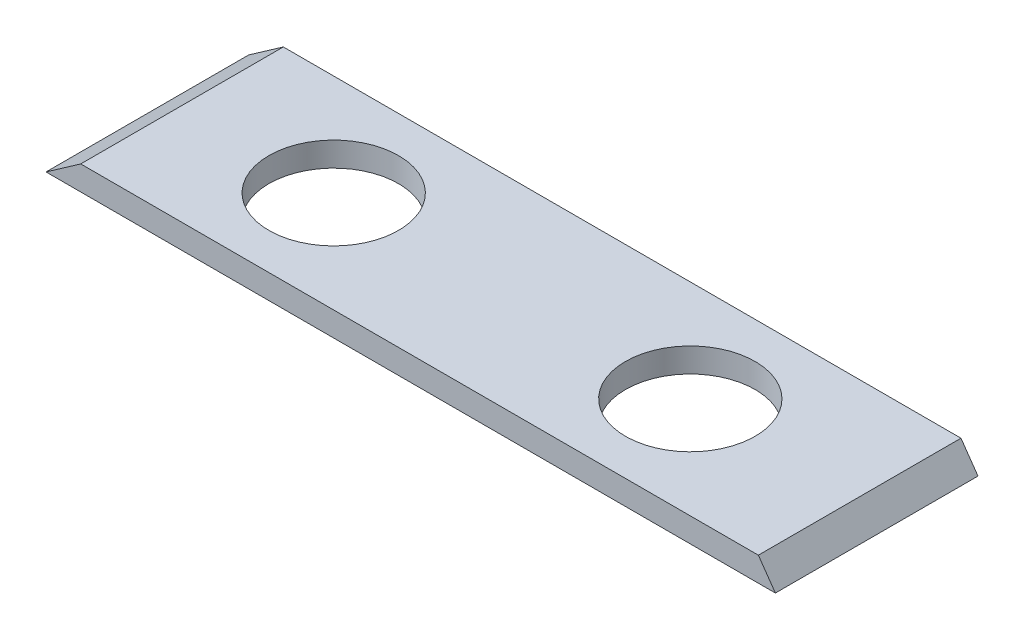
ISO-10303-21;
HEADER;
FILE_DESCRIPTION(('STEP AP214'),'2;1');
FILE_NAME('part.step','',(''),(''),'','','');
FILE_SCHEMA(('AUTOMOTIVE_DESIGN { 1 0 10303 214 1 1 1 1 }'));
ENDSEC;
DATA;
#1=APPLICATION_CONTEXT('core data for automotive mechanical design processes');
#2=APPLICATION_PROTOCOL_DEFINITION('international standard','automotive_design',2000,#1);
#3=PRODUCT_CONTEXT('',#1,'mechanical');
#4=PRODUCT('Part','Part','',(#3));
#5=PRODUCT_RELATED_PRODUCT_CATEGORY('part','',(#4));
#6=PRODUCT_DEFINITION_FORMATION('','',#4);
#7=PRODUCT_DEFINITION_CONTEXT('part definition',#1,'design');
#8=PRODUCT_DEFINITION('design','',#6,#7);
#9=PRODUCT_DEFINITION_SHAPE('','',#8);
#10=(LENGTH_UNIT() NAMED_UNIT(*) SI_UNIT(.MILLI.,.METRE.));
#11=(NAMED_UNIT(*) PLANE_ANGLE_UNIT() SI_UNIT($,.RADIAN.));
#12=(NAMED_UNIT(*) SI_UNIT($,.STERADIAN.) SOLID_ANGLE_UNIT());
#13=UNCERTAINTY_MEASURE_WITH_UNIT(LENGTH_MEASURE(1.E-05),#10,'distance_accuracy_value','');
#14=(GEOMETRIC_REPRESENTATION_CONTEXT(3) GLOBAL_UNCERTAINTY_ASSIGNED_CONTEXT((#13)) GLOBAL_UNIT_ASSIGNED_CONTEXT((#10,
#11,#12)) REPRESENTATION_CONTEXT('',''));
#15=CARTESIAN_POINT('',(0.,0.,0.));
#16=DIRECTION('',(0.,0.,1.));
#17=DIRECTION('',(1.,0.,0.));
#18=AXIS2_PLACEMENT_3D('',#15,#16,#17);
#19=CARTESIAN_POINT('',(-40.7155559797737,2.99999999999999,25.));
#20=DIRECTION('',(0.57357643635105,-0.819152044288989,0.));
#21=DIRECTION('',(0.819152044288989,0.57357643635105,0.));
#22=AXIS2_PLACEMENT_3D('',#19,#20,#21);
#23=PLANE('',#22);
#24=DIRECTION('',(-0.819152044288989,-0.57357643635105,0.));
#25=VECTOR('',#24,1.);
#26=CARTESIAN_POINT('',(-40.7155559797737,2.99999999999999,0.));
#27=LINE('',#26,#25);
#28=CARTESIAN_POINT('',(-40.7155559797737,2.99999999999999,0.));
#29=VERTEX_POINT('',#28);
#30=CARTESIAN_POINT('',(-45.,0.,0.));
#31=VERTEX_POINT('',#30);
#32=EDGE_CURVE('E100',#29,#31,#27,.T.);
#33=ORIENTED_EDGE('',*,*,#32,.T.);
#34=DIRECTION('',(0.,0.,-1.));
#35=VECTOR('',#34,1.);
#36=CARTESIAN_POINT('',(-45.,0.,25.));
#37=LINE('',#36,#35);
#38=CARTESIAN_POINT('',(-45.,0.,25.));
#39=VERTEX_POINT('',#38);
#40=EDGE_CURVE('E11',#39,#31,#37,.T.);
#41=ORIENTED_EDGE('',*,*,#40,.F.);
#42=DIRECTION('',(-0.819152044288989,-0.57357643635105,0.));
#43=VECTOR('',#42,1.);
#44=CARTESIAN_POINT('',(-40.7155559797737,2.99999999999999,25.));
#45=LINE('',#44,#43);
#46=CARTESIAN_POINT('',(-40.7155559797737,2.99999999999999,25.));
#47=VERTEX_POINT('',#46);
#48=EDGE_CURVE('E88',#47,#39,#45,.T.);
#49=ORIENTED_EDGE('',*,*,#48,.F.);
#50=DIRECTION('',(0.,0.,-1.));
#51=VECTOR('',#50,1.);
#52=CARTESIAN_POINT('',(-40.7155559797737,2.99999999999999,25.));
#53=LINE('',#52,#51);
#54=EDGE_CURVE('E96',#47,#29,#53,.T.);
#55=ORIENTED_EDGE('',*,*,#54,.T.);
#56=EDGE_LOOP('',(#33,#41,#49,#55));
#57=FACE_BOUND('',#56,.T.);
#58=ADVANCED_FACE('F37',(#57),#23,.F.);
#59=CARTESIAN_POINT('',(-45.,0.,25.));
#60=DIRECTION('',(0.,1.,0.));
#61=DIRECTION('',(0.,0.,1.));
#62=AXIS2_PLACEMENT_3D('',#59,#60,#61);
#63=PLANE('',#62);
#64=CARTESIAN_POINT('',(-22.,0.,12.5));
#65=DIRECTION('',(0.,1.,0.));
#66=DIRECTION('',(-1.,0.,0.));
#67=AXIS2_PLACEMENT_3D('',#64,#65,#66);
#68=CIRCLE('',#67,8.);
#69=CARTESIAN_POINT('',(-30.,0.,12.5));
#70=VERTEX_POINT('',#69);
#71=EDGE_CURVE('E120',#70,#70,#68,.T.);
#72=ORIENTED_EDGE('',*,*,#71,.T.);
#73=EDGE_LOOP('',(#72));
#74=FACE_BOUND('',#73,.T.);
#75=CARTESIAN_POINT('',(22.,0.,12.5));
#76=DIRECTION('',(0.,1.,0.));
#77=DIRECTION('',(-1.,0.,0.));
#78=AXIS2_PLACEMENT_3D('',#75,#76,#77);
#79=CIRCLE('',#78,8.);
#80=CARTESIAN_POINT('',(14.,0.,12.5));
#81=VERTEX_POINT('',#80);
#82=EDGE_CURVE('E103',#81,#81,#79,.T.);
#83=ORIENTED_EDGE('',*,*,#82,.T.);
#84=EDGE_LOOP('',(#83));
#85=FACE_BOUND('',#84,.T.);
#86=DIRECTION('',(1.,0.,0.));
#87=VECTOR('',#86,1.);
#88=CARTESIAN_POINT('',(-45.,0.,0.));
#89=LINE('',#88,#87);
#90=CARTESIAN_POINT('',(45.,0.,0.));
#91=VERTEX_POINT('',#90);
#92=EDGE_CURVE('E92',#31,#91,#89,.T.);
#93=ORIENTED_EDGE('',*,*,#92,.T.);
#94=DIRECTION('',(0.,0.,-1.));
#95=VECTOR('',#94,1.);
#96=CARTESIAN_POINT('',(45.,0.,25.));
#97=LINE('',#96,#95);
#98=CARTESIAN_POINT('',(45.,0.,25.));
#99=VERTEX_POINT('',#98);
#100=EDGE_CURVE('E45',#99,#91,#97,.T.);
#101=ORIENTED_EDGE('',*,*,#100,.F.);
#102=DIRECTION('',(1.,0.,0.));
#103=VECTOR('',#102,1.);
#104=CARTESIAN_POINT('',(-45.,0.,25.));
#105=LINE('',#104,#103);
#106=EDGE_CURVE('E83',#39,#99,#105,.T.);
#107=ORIENTED_EDGE('',*,*,#106,.F.);
#108=ORIENTED_EDGE('',*,*,#40,.T.);
#109=EDGE_LOOP('',(#93,#101,#107,#108));
#110=FACE_BOUND('',#109,.T.);
#111=ADVANCED_FACE('F91',(#74,#85,#110),#63,.F.);
#112=CARTESIAN_POINT('',(45.,0.,25.));
#113=DIRECTION('',(-0.819152044288991,-0.573576436351047,0.));
#114=DIRECTION('',(0.573576436351047,-0.819152044288991,0.));
#115=AXIS2_PLACEMENT_3D('',#112,#113,#114);
#116=PLANE('',#115);
#117=DIRECTION('',(-0.573576436351047,0.819152044288991,0.));
#118=VECTOR('',#117,1.);
#119=CARTESIAN_POINT('',(45.,0.,0.));
#120=LINE('',#119,#118);
#121=CARTESIAN_POINT('',(42.8993773853709,3.,0.));
#122=VERTEX_POINT('',#121);
#123=EDGE_CURVE('E70',#91,#122,#120,.T.);
#124=ORIENTED_EDGE('',*,*,#123,.T.);
#125=DIRECTION('',(0.,0.,-1.));
#126=VECTOR('',#125,1.);
#127=CARTESIAN_POINT('',(42.8993773853709,3.,25.));
#128=LINE('',#127,#126);
#129=CARTESIAN_POINT('',(42.8993773853709,3.,25.));
#130=VERTEX_POINT('',#129);
#131=EDGE_CURVE('E93',#130,#122,#128,.T.);
#132=ORIENTED_EDGE('',*,*,#131,.F.);
#133=DIRECTION('',(-0.573576436351047,0.819152044288991,0.));
#134=VECTOR('',#133,1.);
#135=CARTESIAN_POINT('',(45.,0.,25.));
#136=LINE('',#135,#134);
#137=EDGE_CURVE('E86',#99,#130,#136,.T.);
#138=ORIENTED_EDGE('',*,*,#137,.F.);
#139=ORIENTED_EDGE('',*,*,#100,.T.);
#140=EDGE_LOOP('',(#124,#132,#138,#139));
#141=FACE_BOUND('',#140,.T.);
#142=ADVANCED_FACE('F94',(#141),#116,.F.);
#143=CARTESIAN_POINT('',(42.8993773853709,3.,25.));
#144=DIRECTION('',(0.,-1.,0.));
#145=DIRECTION('',(1.,0.,0.));
#146=AXIS2_PLACEMENT_3D('',#143,#144,#145);
#147=PLANE('',#146);
#148=CARTESIAN_POINT('',(-22.,2.99999999999999,12.5));
#149=DIRECTION('',(0.,1.,0.));
#150=DIRECTION('',(-1.,0.,0.));
#151=AXIS2_PLACEMENT_3D('',#148,#149,#150);
#152=CIRCLE('',#151,8.);
#153=CARTESIAN_POINT('',(-30.,2.99999999999999,12.5));
#154=VERTEX_POINT('',#153);
#155=EDGE_CURVE('E117',#154,#154,#152,.T.);
#156=ORIENTED_EDGE('',*,*,#155,.F.);
#157=EDGE_LOOP('',(#156));
#158=FACE_BOUND('',#157,.T.);
#159=CARTESIAN_POINT('',(22.,3.,12.5));
#160=DIRECTION('',(0.,1.,0.));
#161=DIRECTION('',(-1.,0.,0.));
#162=AXIS2_PLACEMENT_3D('',#159,#160,#161);
#163=CIRCLE('',#162,8.);
#164=CARTESIAN_POINT('',(14.,2.99999999999999,12.5));
#165=VERTEX_POINT('',#164);
#166=EDGE_CURVE('E114',#165,#165,#163,.T.);
#167=ORIENTED_EDGE('',*,*,#166,.F.);
#168=EDGE_LOOP('',(#167));
#169=FACE_BOUND('',#168,.T.);
#170=DIRECTION('',(-1.,0.,0.));
#171=VECTOR('',#170,1.);
#172=CARTESIAN_POINT('',(42.8993773853709,3.,0.));
#173=LINE('',#172,#171);
#174=EDGE_CURVE('E76',#122,#29,#173,.T.);
#175=ORIENTED_EDGE('',*,*,#174,.T.);
#176=ORIENTED_EDGE('',*,*,#54,.F.);
#177=DIRECTION('',(-1.,0.,0.));
#178=VECTOR('',#177,1.);
#179=CARTESIAN_POINT('',(42.8993773853709,3.,25.));
#180=LINE('',#179,#178);
#181=EDGE_CURVE('E53',#130,#47,#180,.T.);
#182=ORIENTED_EDGE('',*,*,#181,.F.);
#183=ORIENTED_EDGE('',*,*,#131,.T.);
#184=EDGE_LOOP('',(#175,#176,#182,#183));
#185=FACE_BOUND('',#184,.T.);
#186=ADVANCED_FACE('F108',(#158,#169,#185),#147,.F.);
#187=CARTESIAN_POINT('',(0.,0.,25.));
#188=DIRECTION('',(0.,0.,-1.));
#189=DIRECTION('',(-1.,0.,0.));
#190=AXIS2_PLACEMENT_3D('',#187,#188,#189);
#191=PLANE('',#190);
#192=ORIENTED_EDGE('',*,*,#48,.T.);
#193=ORIENTED_EDGE('',*,*,#106,.T.);
#194=ORIENTED_EDGE('',*,*,#137,.T.);
#195=ORIENTED_EDGE('',*,*,#181,.T.);
#196=EDGE_LOOP('',(#192,#193,#194,#195));
#197=FACE_BOUND('',#196,.T.);
#198=ADVANCED_FACE('F84',(#197),#191,.F.);
#199=CARTESIAN_POINT('',(0.,0.,0.));
#200=DIRECTION('',(0.,0.,-1.));
#201=DIRECTION('',(-1.,0.,0.));
#202=AXIS2_PLACEMENT_3D('',#199,#200,#201);
#203=PLANE('',#202);
#204=ORIENTED_EDGE('',*,*,#32,.F.);
#205=ORIENTED_EDGE('',*,*,#174,.F.);
#206=ORIENTED_EDGE('',*,*,#123,.F.);
#207=ORIENTED_EDGE('',*,*,#92,.F.);
#208=EDGE_LOOP('',(#204,#205,#206,#207));
#209=FACE_BOUND('',#208,.T.);
#210=ADVANCED_FACE('F111',(#209),#203,.T.);
#211=CARTESIAN_POINT('',(22.,0.,12.5));
#212=DIRECTION('',(0.,1.,0.));
#213=DIRECTION('',(-1.,0.,0.));
#214=AXIS2_PLACEMENT_3D('',#211,#212,#213);
#215=CYLINDRICAL_SURFACE('',#214,8.);
#216=ORIENTED_EDGE('',*,*,#82,.F.);
#217=EDGE_LOOP('',(#216));
#218=FACE_BOUND('',#217,.T.);
#219=ORIENTED_EDGE('',*,*,#166,.T.);
#220=EDGE_LOOP('',(#219));
#221=FACE_BOUND('',#220,.T.);
#222=ADVANCED_FACE('F133',(#218,#221),#215,.F.);
#223=CARTESIAN_POINT('',(-22.,0.,12.5));
#224=DIRECTION('',(0.,1.,0.));
#225=DIRECTION('',(-1.,0.,0.));
#226=AXIS2_PLACEMENT_3D('',#223,#224,#225);
#227=CYLINDRICAL_SURFACE('',#226,8.);
#228=ORIENTED_EDGE('',*,*,#71,.F.);
#229=EDGE_LOOP('',(#228));
#230=FACE_BOUND('',#229,.T.);
#231=ORIENTED_EDGE('',*,*,#155,.T.);
#232=EDGE_LOOP('',(#231));
#233=FACE_BOUND('',#232,.T.);
#234=ADVANCED_FACE('F126',(#230,#233),#227,.F.);
#235=CLOSED_SHELL('',(#58,#111,#142,#186,#198,#210,#222,#234));
#236=MANIFOLD_SOLID_BREP('B2',#235);
#237=ADVANCED_BREP_SHAPE_REPRESENTATION('',(#18,#236),#14);
#238=SHAPE_DEFINITION_REPRESENTATION(#9,#237);
ENDSEC;
END-ISO-10303-21;
